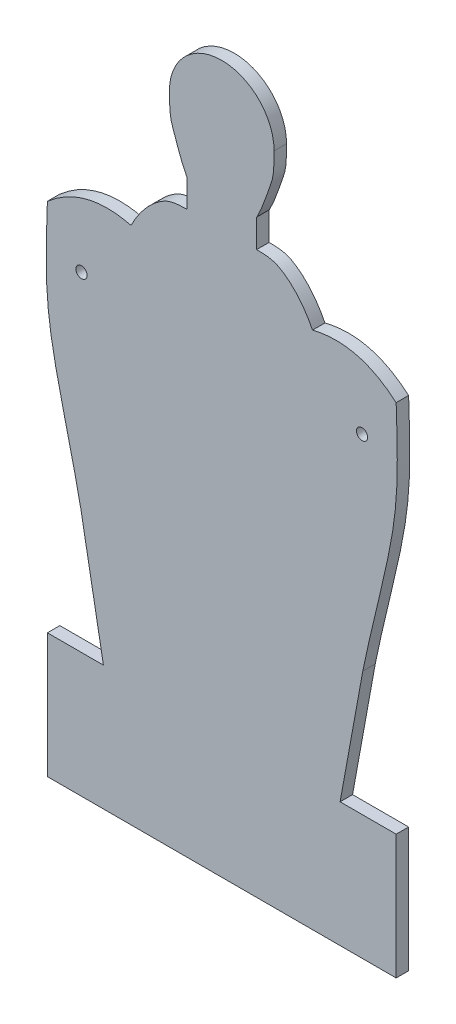
ISO-10303-21;
HEADER;
FILE_DESCRIPTION(('STEP AP214'),'2;1');
FILE_NAME('part.step','',(''),(''),'','','');
FILE_SCHEMA(('AUTOMOTIVE_DESIGN { 1 0 10303 214 1 1 1 1 }'));
ENDSEC;
DATA;
#1=APPLICATION_CONTEXT('core data for automotive mechanical design processes');
#2=APPLICATION_PROTOCOL_DEFINITION('international standard','automotive_design',2000,#1);
#3=PRODUCT_CONTEXT('',#1,'mechanical');
#4=PRODUCT('Part','Part','',(#3));
#5=PRODUCT_RELATED_PRODUCT_CATEGORY('part','',(#4));
#6=PRODUCT_DEFINITION_FORMATION('','',#4);
#7=PRODUCT_DEFINITION_CONTEXT('part definition',#1,'design');
#8=PRODUCT_DEFINITION('design','',#6,#7);
#9=PRODUCT_DEFINITION_SHAPE('','',#8);
#10=(LENGTH_UNIT() NAMED_UNIT(*) SI_UNIT(.MILLI.,.METRE.));
#11=(NAMED_UNIT(*) PLANE_ANGLE_UNIT() SI_UNIT($,.RADIAN.));
#12=(NAMED_UNIT(*) SI_UNIT($,.STERADIAN.) SOLID_ANGLE_UNIT());
#13=UNCERTAINTY_MEASURE_WITH_UNIT(LENGTH_MEASURE(1.E-05),#10,'distance_accuracy_value','');
#14=(GEOMETRIC_REPRESENTATION_CONTEXT(3) GLOBAL_UNCERTAINTY_ASSIGNED_CONTEXT((#13)) GLOBAL_UNIT_ASSIGNED_CONTEXT((#10,
#11,#12)) REPRESENTATION_CONTEXT('',''));
#15=CARTESIAN_POINT('',(0.,0.,0.));
#16=DIRECTION('',(0.,0.,1.));
#17=DIRECTION('',(1.,0.,0.));
#18=AXIS2_PLACEMENT_3D('',#15,#16,#17);
#19=CARTESIAN_POINT('',(37.1614459561657,-6.76783935625519,5.));
#20=DIRECTION('',(-0.983817622568775,0.179172781200503,0.));
#21=DIRECTION('',(-0.179172781200503,-0.983817622568775,0.));
#22=AXIS2_PLACEMENT_3D('',#19,#20,#21);
#23=PLANE('',#22);
#24=DIRECTION('',(0.179172781200503,0.983817622568775,0.));
#25=VECTOR('',#24,1.);
#26=CARTESIAN_POINT('',(37.1614459561657,-6.76783935625519,0.));
#27=LINE('',#26,#25);
#28=CARTESIAN_POINT('',(47.4999999999997,49.9999999999998,0.));
#29=VERTEX_POINT('',#28);
#30=CARTESIAN_POINT('',(56.6059957196473,100.,0.));
#31=VERTEX_POINT('',#30);
#32=EDGE_CURVE('E213',#29,#31,#27,.T.);
#33=ORIENTED_EDGE('',*,*,#32,.T.);
#34=DIRECTION('',(0.,0.,-1.));
#35=VECTOR('',#34,1.);
#36=CARTESIAN_POINT('',(56.6059957196473,100.,5.));
#37=LINE('',#36,#35);
#38=CARTESIAN_POINT('',(56.6059957196473,100.,5.));
#39=VERTEX_POINT('',#38);
#40=EDGE_CURVE('E11',#39,#31,#37,.T.);
#41=ORIENTED_EDGE('',*,*,#40,.F.);
#42=DIRECTION('',(0.179172781200503,0.983817622568775,0.));
#43=VECTOR('',#42,1.);
#44=CARTESIAN_POINT('',(37.1614459561657,-6.76783935625519,5.));
#45=LINE('',#44,#43);
#46=CARTESIAN_POINT('',(47.4999999999997,49.9999999999998,5.));
#47=VERTEX_POINT('',#46);
#48=EDGE_CURVE('E324',#47,#39,#45,.T.);
#49=ORIENTED_EDGE('',*,*,#48,.F.);
#50=DIRECTION('',(0.,0.,-1.));
#51=VECTOR('',#50,1.);
#52=CARTESIAN_POINT('',(47.4999999999997,49.9999999999998,5.));
#53=LINE('',#52,#51);
#54=EDGE_CURVE('E209',#47,#29,#53,.T.);
#55=ORIENTED_EDGE('',*,*,#54,.T.);
#56=EDGE_LOOP('',(#33,#41,#49,#55));
#57=FACE_BOUND('',#56,.T.);
#58=ADVANCED_FACE('F40',(#57),#23,.F.);
#59=CARTESIAN_POINT('',(56.605995719648,100.,5.));
#60=CARTESIAN_POINT('',(58.8228815779306,111.230467147006,5.));
#61=CARTESIAN_POINT('',(70.6241014531381,157.653217098023,5.));
#62=CARTESIAN_POINT('',(70.9834961751367,170.948411874981,5.));
#63=CARTESIAN_POINT('',(70.,200.,5.));
#64=B_SPLINE_CURVE_WITH_KNOTS('',3,(#59,#60,#61,#62,#63),.UNSPECIFIED.,.F.,.F.,(4,1,4),(0.,
0.304799143868589,1.),.UNSPECIFIED.);
#65=DIRECTION('',(0.,0.,-1.));
#66=VECTOR('',#65,1.);
#67=SURFACE_OF_LINEAR_EXTRUSION('',#64,#66);
#68=CARTESIAN_POINT('',(56.605995719648,100.,0.));
#69=CARTESIAN_POINT('',(58.8228815779306,111.230467147006,0.));
#70=CARTESIAN_POINT('',(70.6241014531381,157.653217098023,0.));
#71=CARTESIAN_POINT('',(70.9834961751367,170.948411874981,0.));
#72=CARTESIAN_POINT('',(70.,200.,0.));
#73=B_SPLINE_CURVE_WITH_KNOTS('',3,(#68,#69,#70,#71,#72),.UNSPECIFIED.,.F.,.F.,(4,1,4),(0.,
0.304799143868589,1.),.UNSPECIFIED.);
#74=CARTESIAN_POINT('',(70.,200.,0.));
#75=VERTEX_POINT('',#74);
#76=EDGE_CURVE('E217',#31,#75,#73,.T.);
#77=ORIENTED_EDGE('',*,*,#76,.T.);
#78=DIRECTION('',(0.,0.,-1.));
#79=VECTOR('',#78,1.);
#80=CARTESIAN_POINT('',(70.,200.,5.));
#81=LINE('',#80,#79);
#82=CARTESIAN_POINT('',(70.,200.,5.));
#83=VERTEX_POINT('',#82);
#84=EDGE_CURVE('E49',#83,#75,#81,.T.);
#85=ORIENTED_EDGE('',*,*,#84,.F.);
#86=EDGE_CURVE('E136',#39,#83,#64,.T.);
#87=ORIENTED_EDGE('',*,*,#86,.F.);
#88=ORIENTED_EDGE('',*,*,#40,.T.);
#89=EDGE_LOOP('',(#77,#85,#87,#88));
#90=FACE_BOUND('',#89,.T.);
#91=ADVANCED_FACE('F422',(#90),#67,.F.);
#92=CARTESIAN_POINT('',(70.,200.,5.));
#93=CARTESIAN_POINT('',(54.9401728125551,213.077606656777,5.));
#94=CARTESIAN_POINT('',(36.4,208.4,5.));
#95=B_SPLINE_CURVE_WITH_KNOTS('',2,(#92,#93,#94),.UNSPECIFIED.,.F.,.F.,(3,3),(0.,1.),.UNSPECIFIED.);
#96=DIRECTION('',(0.,0.,-1.));
#97=VECTOR('',#96,1.);
#98=SURFACE_OF_LINEAR_EXTRUSION('',#95,#97);
#99=CARTESIAN_POINT('',(70.,200.,0.));
#100=CARTESIAN_POINT('',(54.9401728125551,213.077606656777,0.));
#101=CARTESIAN_POINT('',(36.4,208.4,0.));
#102=B_SPLINE_CURVE_WITH_KNOTS('',2,(#99,#100,#101),.UNSPECIFIED.,.F.,.F.,(3,3),(0.,1.),.UNSPECIFIED.);
#103=CARTESIAN_POINT('',(36.4,208.4,0.));
#104=VERTEX_POINT('',#103);
#105=EDGE_CURVE('E223',#75,#104,#102,.T.);
#106=ORIENTED_EDGE('',*,*,#105,.T.);
#107=DIRECTION('',(0.,0.,-1.));
#108=VECTOR('',#107,1.);
#109=CARTESIAN_POINT('',(36.4,208.4,5.));
#110=LINE('',#109,#108);
#111=CARTESIAN_POINT('',(36.4,208.4,5.));
#112=VERTEX_POINT('',#111);
#113=EDGE_CURVE('E372',#112,#104,#110,.T.);
#114=ORIENTED_EDGE('',*,*,#113,.F.);
#115=EDGE_CURVE('E382',#83,#112,#95,.T.);
#116=ORIENTED_EDGE('',*,*,#115,.F.);
#117=ORIENTED_EDGE('',*,*,#84,.T.);
#118=EDGE_LOOP('',(#106,#114,#116,#117));
#119=FACE_BOUND('',#118,.T.);
#120=ADVANCED_FACE('F380',(#119),#98,.F.);
#121=CARTESIAN_POINT('',(36.4,208.4,5.));
#122=CARTESIAN_POINT('',(36.3844257793692,208.408148411344,5.));
#123=CARTESIAN_POINT('',(31.8537188994462,218.69503534175,5.));
#124=CARTESIAN_POINT('',(19.6252294284112,225.496752596779,5.));
#125=CARTESIAN_POINT('',(14.2871200733306,225.126645693906,5.));
#126=CARTESIAN_POINT('',(13.9999999999992,225.2,5.));
#127=B_SPLINE_CURVE_WITH_KNOTS('',3,(#121,#122,#123,#124,#125,#126),.UNSPECIFIED.,.F.,.F.,(4,1,
1,4),(0.,0.552885047506551,0.635199121808182,0.823140743016311),.UNSPECIFIED.);
#128=DIRECTION('',(0.,0.,-1.));
#129=VECTOR('',#128,1.);
#130=SURFACE_OF_LINEAR_EXTRUSION('',#127,#129);
#131=CARTESIAN_POINT('',(36.4,208.4,0.));
#132=CARTESIAN_POINT('',(36.3844257793692,208.408148411344,0.));
#133=CARTESIAN_POINT('',(31.8537188994462,218.69503534175,0.));
#134=CARTESIAN_POINT('',(19.6252294284112,225.496752596779,0.));
#135=CARTESIAN_POINT('',(14.2871200733306,225.126645693906,0.));
#136=CARTESIAN_POINT('',(13.9999999999992,225.2,0.));
#137=B_SPLINE_CURVE_WITH_KNOTS('',3,(#131,#132,#133,#134,#135,#136),.UNSPECIFIED.,.F.,.F.,(4,1,
1,4),(0.,0.552885047506551,0.635199121808182,0.823140743016311),.UNSPECIFIED.);
#138=CARTESIAN_POINT('',(13.9999999999987,225.2,0.));
#139=VERTEX_POINT('',#138);
#140=EDGE_CURVE('E231',#104,#139,#137,.T.);
#141=ORIENTED_EDGE('',*,*,#140,.T.);
#142=DIRECTION('',(0.,0.,-1.));
#143=VECTOR('',#142,1.);
#144=CARTESIAN_POINT('',(13.9999999999987,225.2,5.));
#145=LINE('',#144,#143);
#146=CARTESIAN_POINT('',(13.9999999999987,225.2,5.));
#147=VERTEX_POINT('',#146);
#148=EDGE_CURVE('E369',#147,#139,#145,.T.);
#149=ORIENTED_EDGE('',*,*,#148,.F.);
#150=EDGE_CURVE('E394',#112,#147,#127,.T.);
#151=ORIENTED_EDGE('',*,*,#150,.F.);
#152=ORIENTED_EDGE('',*,*,#113,.T.);
#153=EDGE_LOOP('',(#141,#149,#151,#152));
#154=FACE_BOUND('',#153,.T.);
#155=ADVANCED_FACE('F391',(#154),#130,.F.);
#156=CARTESIAN_POINT('',(13.9999999999892,-5.91032277210079E-13,5.));
#157=DIRECTION('',(1.,0.,0.));
#158=DIRECTION('',(0.,1.,0.));
#159=AXIS2_PLACEMENT_3D('',#156,#157,#158);
#160=PLANE('',#159);
#161=DIRECTION('',(0.,-1.,0.));
#162=VECTOR('',#161,1.);
#163=CARTESIAN_POINT('',(13.9999999999892,-5.91032277210079E-13,0.));
#164=LINE('',#163,#162);
#165=CARTESIAN_POINT('',(13.9999999999992,236.488415854173,0.));
#166=VERTEX_POINT('',#165);
#167=EDGE_CURVE('E240',#166,#139,#164,.T.);
#168=ORIENTED_EDGE('',*,*,#167,.F.);
#169=DIRECTION('',(0.,0.,-1.));
#170=VECTOR('',#169,1.);
#171=CARTESIAN_POINT('',(13.9999999999992,236.488415854173,5.));
#172=LINE('',#171,#170);
#173=CARTESIAN_POINT('',(13.9999999999992,236.488415854173,5.));
#174=VERTEX_POINT('',#173);
#175=EDGE_CURVE('E366',#174,#166,#172,.T.);
#176=ORIENTED_EDGE('',*,*,#175,.F.);
#177=DIRECTION('',(0.,-1.,0.));
#178=VECTOR('',#177,1.);
#179=CARTESIAN_POINT('',(13.9999999999892,-5.91032277210079E-13,5.));
#180=LINE('',#179,#178);
#181=EDGE_CURVE('E397',#174,#147,#180,.T.);
#182=ORIENTED_EDGE('',*,*,#181,.T.);
#183=ORIENTED_EDGE('',*,*,#148,.T.);
#184=EDGE_LOOP('',(#168,#176,#182,#183));
#185=FACE_BOUND('',#184,.T.);
#186=ADVANCED_FACE('F419',(#185),#160,.T.);
#187=CARTESIAN_POINT('',(13.2883216349393,237.190921302341,5.));
#188=DIRECTION('',(0.,0.,-1.));
#189=DIRECTION('',(-1.,0.,0.));
#190=AXIS2_PLACEMENT_3D('',#187,#188,#189);
#191=CYLINDRICAL_SURFACE('',#190,0.99999999999988);
#192=CARTESIAN_POINT('',(13.2883216349393,237.190921302341,0.));
#193=DIRECTION('',(0.,0.,1.));
#194=DIRECTION('',(1.,0.,0.));
#195=AXIS2_PLACEMENT_3D('',#192,#193,#194);
#196=CIRCLE('',#195,0.99999999999988);
#197=CARTESIAN_POINT('',(14.1721420775489,236.723095025583,0.));
#198=VERTEX_POINT('',#197);
#199=EDGE_CURVE('E247',#166,#198,#196,.T.);
#200=ORIENTED_EDGE('',*,*,#199,.T.);
#201=DIRECTION('',(0.,0.,-1.));
#202=VECTOR('',#201,1.);
#203=CARTESIAN_POINT('',(14.1721420775489,236.723095025583,5.));
#204=LINE('',#203,#202);
#205=CARTESIAN_POINT('',(14.1721420775489,236.723095025583,5.));
#206=VERTEX_POINT('',#205);
#207=EDGE_CURVE('E362',#206,#198,#204,.T.);
#208=ORIENTED_EDGE('',*,*,#207,.F.);
#209=CARTESIAN_POINT('',(13.2883216349393,237.190921302341,5.));
#210=DIRECTION('',(0.,0.,1.));
#211=DIRECTION('',(1.,0.,0.));
#212=AXIS2_PLACEMENT_3D('',#209,#210,#211);
#213=CIRCLE('',#212,0.99999999999988);
#214=EDGE_CURVE('E401',#174,#206,#213,.T.);
#215=ORIENTED_EDGE('',*,*,#214,.F.);
#216=ORIENTED_EDGE('',*,*,#175,.T.);
#217=EDGE_LOOP('',(#200,#208,#215,#216));
#218=FACE_BOUND('',#217,.T.);
#219=ADVANCED_FACE('F545',(#218),#191,.T.);
#220=CARTESIAN_POINT('',(14.1721420775506,236.723095025583,5.));
#221=CARTESIAN_POINT('',(16.4386826222362,241.005058153603,5.));
#222=CARTESIAN_POINT('',(19.848023934084,251.9613261609,5.));
#223=CARTESIAN_POINT('',(20.9809390103609,253.933353369458,5.));
#224=CARTESIAN_POINT('',(21.,263.,5.));
#225=B_SPLINE_CURVE_WITH_KNOTS('',3,(#220,#221,#222,#223,#224),.UNSPECIFIED.,.F.,.F.,(4,1,4),
(0.00927567658189249,0.377960332412219,0.746644988242546),.UNSPECIFIED.);
#226=DIRECTION('',(0.,0.,-1.));
#227=VECTOR('',#226,1.);
#228=SURFACE_OF_LINEAR_EXTRUSION('',#225,#227);
#229=CARTESIAN_POINT('',(14.1721420775506,236.723095025583,0.));
#230=CARTESIAN_POINT('',(16.4386826222362,241.005058153603,0.));
#231=CARTESIAN_POINT('',(19.848023934084,251.9613261609,0.));
#232=CARTESIAN_POINT('',(20.9809390103609,253.933353369458,0.));
#233=CARTESIAN_POINT('',(21.,263.,0.));
#234=B_SPLINE_CURVE_WITH_KNOTS('',3,(#229,#230,#231,#232,#233),.UNSPECIFIED.,.F.,.F.,(4,1,4),
(0.00927567658189249,0.377960332412219,0.746644988242546),.UNSPECIFIED.);
#235=CARTESIAN_POINT('',(20.9999999999991,263.,0.));
#236=VERTEX_POINT('',#235);
#237=EDGE_CURVE('E250',#198,#236,#234,.T.);
#238=ORIENTED_EDGE('',*,*,#237,.T.);
#239=DIRECTION('',(0.,0.,-1.));
#240=VECTOR('',#239,1.);
#241=CARTESIAN_POINT('',(20.9999999999991,263.,5.));
#242=LINE('',#241,#240);
#243=CARTESIAN_POINT('',(20.9999999999991,263.,5.));
#244=VERTEX_POINT('',#243);
#245=EDGE_CURVE('E358',#244,#236,#242,.T.);
#246=ORIENTED_EDGE('',*,*,#245,.F.);
#247=EDGE_CURVE('E539',#206,#244,#225,.T.);
#248=ORIENTED_EDGE('',*,*,#247,.F.);
#249=ORIENTED_EDGE('',*,*,#207,.T.);
#250=EDGE_LOOP('',(#238,#246,#248,#249));
#251=FACE_BOUND('',#250,.T.);
#252=ADVANCED_FACE('F538',(#251),#228,.F.);
#253=CARTESIAN_POINT('',(0.,263.,5.));
#254=DIRECTION('',(0.,0.,-1.));
#255=DIRECTION('',(-1.,0.,0.));
#256=AXIS2_PLACEMENT_3D('',#253,#254,#255);
#257=CYLINDRICAL_SURFACE('',#256,20.9999999999991);
#258=CARTESIAN_POINT('',(0.,263.,0.));
#259=DIRECTION('',(0.,0.,1.));
#260=DIRECTION('',(1.,0.,0.));
#261=AXIS2_PLACEMENT_3D('',#258,#259,#260);
#262=CIRCLE('',#261,20.9999999999991);
#263=CARTESIAN_POINT('',(-20.9999999999991,263.,0.));
#264=VERTEX_POINT('',#263);
#265=EDGE_CURVE('E255',#236,#264,#262,.T.);
#266=ORIENTED_EDGE('',*,*,#265,.T.);
#267=DIRECTION('',(0.,0.,-1.));
#268=VECTOR('',#267,1.);
#269=CARTESIAN_POINT('',(-20.9999999999991,263.,5.));
#270=LINE('',#269,#268);
#271=CARTESIAN_POINT('',(-20.9999999999991,263.,5.));
#272=VERTEX_POINT('',#271);
#273=EDGE_CURVE('E355',#272,#264,#270,.T.);
#274=ORIENTED_EDGE('',*,*,#273,.F.);
#275=CARTESIAN_POINT('',(0.,263.,5.));
#276=DIRECTION('',(0.,0.,1.));
#277=DIRECTION('',(1.,0.,0.));
#278=AXIS2_PLACEMENT_3D('',#275,#276,#277);
#279=CIRCLE('',#278,20.9999999999991);
#280=EDGE_CURVE('E535',#244,#272,#279,.T.);
#281=ORIENTED_EDGE('',*,*,#280,.F.);
#282=ORIENTED_EDGE('',*,*,#245,.T.);
#283=EDGE_LOOP('',(#266,#274,#281,#282));
#284=FACE_BOUND('',#283,.T.);
#285=ADVANCED_FACE('F533',(#284),#257,.T.);
#286=CARTESIAN_POINT('',(-14.1721420775506,236.723095025583,5.));
#287=CARTESIAN_POINT('',(-16.4386826222362,241.005058153603,5.));
#288=CARTESIAN_POINT('',(-19.848023934084,251.9613261609,5.));
#289=CARTESIAN_POINT('',(-20.9809390103609,253.933353369458,5.));
#290=CARTESIAN_POINT('',(-21.,263.,5.));
#291=B_SPLINE_CURVE_WITH_KNOTS('',3,(#286,#287,#288,#289,#290),.UNSPECIFIED.,.F.,.F.,(4,1,4),
(0.00927567658189249,0.377960332412219,0.746644988242546),.UNSPECIFIED.);
#292=DIRECTION('',(0.,0.,-1.));
#293=VECTOR('',#292,1.);
#294=SURFACE_OF_LINEAR_EXTRUSION('',#291,#293);
#295=CARTESIAN_POINT('',(-14.1721420775506,236.723095025583,0.));
#296=CARTESIAN_POINT('',(-16.4386826222362,241.005058153603,0.));
#297=CARTESIAN_POINT('',(-19.848023934084,251.9613261609,0.));
#298=CARTESIAN_POINT('',(-20.9809390103609,253.933353369458,0.));
#299=CARTESIAN_POINT('',(-21.,263.,0.));
#300=B_SPLINE_CURVE_WITH_KNOTS('',3,(#295,#296,#297,#298,#299),.UNSPECIFIED.,.F.,.F.,(4,1,4),
(0.00927567658189249,0.377960332412219,0.746644988242546),.UNSPECIFIED.);
#301=CARTESIAN_POINT('',(-14.17214207755,236.723095025583,0.));
#302=VERTEX_POINT('',#301);
#303=EDGE_CURVE('E262',#302,#264,#300,.T.);
#304=ORIENTED_EDGE('',*,*,#303,.F.);
#305=DIRECTION('',(0.,0.,-1.));
#306=VECTOR('',#305,1.);
#307=CARTESIAN_POINT('',(-14.17214207755,236.723095025583,5.));
#308=LINE('',#307,#306);
#309=CARTESIAN_POINT('',(-14.17214207755,236.723095025583,5.));
#310=VERTEX_POINT('',#309);
#311=EDGE_CURVE('E352',#310,#302,#308,.T.);
#312=ORIENTED_EDGE('',*,*,#311,.F.);
#313=EDGE_CURVE('E530',#310,#272,#291,.T.);
#314=ORIENTED_EDGE('',*,*,#313,.T.);
#315=ORIENTED_EDGE('',*,*,#273,.T.);
#316=EDGE_LOOP('',(#304,#312,#314,#315));
#317=FACE_BOUND('',#316,.T.);
#318=ADVANCED_FACE('F526',(#317),#294,.T.);
#319=CARTESIAN_POINT('',(-13.288321634941,237.190921302341,5.));
#320=DIRECTION('',(0.,0.,-1.));
#321=DIRECTION('',(-1.,0.,0.));
#322=AXIS2_PLACEMENT_3D('',#319,#320,#321);
#323=CYLINDRICAL_SURFACE('',#322,0.99999999999929);
#324=CARTESIAN_POINT('',(-13.288321634941,237.190921302341,0.));
#325=DIRECTION('',(0.,0.,1.));
#326=DIRECTION('',(1.,0.,0.));
#327=AXIS2_PLACEMENT_3D('',#324,#325,#326);
#328=CIRCLE('',#327,0.99999999999929);
#329=CARTESIAN_POINT('',(-13.9999999999992,236.488415854173,0.));
#330=VERTEX_POINT('',#329);
#331=EDGE_CURVE('E268',#330,#302,#328,.F.);
#332=ORIENTED_EDGE('',*,*,#331,.F.);
#333=DIRECTION('',(0.,0.,-1.));
#334=VECTOR('',#333,1.);
#335=CARTESIAN_POINT('',(-13.9999999999992,236.488415854173,5.));
#336=LINE('',#335,#334);
#337=CARTESIAN_POINT('',(-13.9999999999992,236.488415854173,5.));
#338=VERTEX_POINT('',#337);
#339=EDGE_CURVE('E349',#338,#330,#336,.T.);
#340=ORIENTED_EDGE('',*,*,#339,.F.);
#341=CARTESIAN_POINT('',(-13.288321634941,237.190921302341,5.));
#342=DIRECTION('',(0.,0.,1.));
#343=DIRECTION('',(1.,0.,0.));
#344=AXIS2_PLACEMENT_3D('',#341,#342,#343);
#345=CIRCLE('',#344,0.99999999999929);
#346=EDGE_CURVE('E521',#338,#310,#345,.F.);
#347=ORIENTED_EDGE('',*,*,#346,.T.);
#348=ORIENTED_EDGE('',*,*,#311,.T.);
#349=EDGE_LOOP('',(#332,#340,#347,#348));
#350=FACE_BOUND('',#349,.T.);
#351=ADVANCED_FACE('F520',(#350),#323,.T.);
#352=CARTESIAN_POINT('',(-14.0000000000107,6.80190430950842E-13,5.));
#353=DIRECTION('',(1.,0.,0.));
#354=DIRECTION('',(0.,1.,0.));
#355=AXIS2_PLACEMENT_3D('',#352,#353,#354);
#356=PLANE('',#355);
#357=DIRECTION('',(0.,-1.,0.));
#358=VECTOR('',#357,1.);
#359=CARTESIAN_POINT('',(-14.0000000000107,6.80190430950842E-13,0.));
#360=LINE('',#359,#358);
#361=CARTESIAN_POINT('',(-13.9999999999997,225.2,0.));
#362=VERTEX_POINT('',#361);
#363=EDGE_CURVE('E275',#330,#362,#360,.T.);
#364=ORIENTED_EDGE('',*,*,#363,.T.);
#365=DIRECTION('',(0.,0.,-1.));
#366=VECTOR('',#365,1.);
#367=CARTESIAN_POINT('',(-13.9999999999997,225.2,5.));
#368=LINE('',#367,#366);
#369=CARTESIAN_POINT('',(-13.9999999999997,225.2,5.));
#370=VERTEX_POINT('',#369);
#371=EDGE_CURVE('E346',#370,#362,#368,.T.);
#372=ORIENTED_EDGE('',*,*,#371,.F.);
#373=DIRECTION('',(0.,-1.,0.));
#374=VECTOR('',#373,1.);
#375=CARTESIAN_POINT('',(-14.0000000000107,6.80190430950842E-13,5.));
#376=LINE('',#375,#374);
#377=EDGE_CURVE('E516',#338,#370,#376,.T.);
#378=ORIENTED_EDGE('',*,*,#377,.F.);
#379=ORIENTED_EDGE('',*,*,#339,.T.);
#380=EDGE_LOOP('',(#364,#372,#378,#379));
#381=FACE_BOUND('',#380,.T.);
#382=ADVANCED_FACE('F515',(#381),#356,.F.);
#383=CARTESIAN_POINT('',(-36.4,208.4,5.));
#384=CARTESIAN_POINT('',(-36.3844257793692,208.408148411344,5.));
#385=CARTESIAN_POINT('',(-31.8537188994462,218.69503534175,5.));
#386=CARTESIAN_POINT('',(-19.6252294284112,225.496752596779,5.));
#387=CARTESIAN_POINT('',(-14.2871200733306,225.126645693906,5.));
#388=CARTESIAN_POINT('',(-13.9999999999992,225.2,5.));
#389=B_SPLINE_CURVE_WITH_KNOTS('',3,(#383,#384,#385,#386,#387,#388),.UNSPECIFIED.,.F.,.F.,(4,1,
1,4),(0.,0.552885047506551,0.635199121808182,0.823140743016311),.UNSPECIFIED.);
#390=DIRECTION('',(0.,0.,-1.));
#391=VECTOR('',#390,1.);
#392=SURFACE_OF_LINEAR_EXTRUSION('',#389,#391);
#393=CARTESIAN_POINT('',(-36.4,208.4,0.));
#394=CARTESIAN_POINT('',(-36.3844257793692,208.408148411344,0.));
#395=CARTESIAN_POINT('',(-31.8537188994462,218.69503534175,0.));
#396=CARTESIAN_POINT('',(-19.6252294284112,225.496752596779,0.));
#397=CARTESIAN_POINT('',(-14.2871200733306,225.126645693906,0.));
#398=CARTESIAN_POINT('',(-13.9999999999992,225.2,0.));
#399=B_SPLINE_CURVE_WITH_KNOTS('',3,(#393,#394,#395,#396,#397,#398),.UNSPECIFIED.,.F.,.F.,(4,1,
1,4),(0.,0.552885047506551,0.635199121808182,0.823140743016311),.UNSPECIFIED.);
#400=CARTESIAN_POINT('',(-36.4,208.4,0.));
#401=VERTEX_POINT('',#400);
#402=EDGE_CURVE('E279',#401,#362,#399,.T.);
#403=ORIENTED_EDGE('',*,*,#402,.F.);
#404=DIRECTION('',(0.,0.,-1.));
#405=VECTOR('',#404,1.);
#406=CARTESIAN_POINT('',(-36.4,208.4,5.));
#407=LINE('',#406,#405);
#408=CARTESIAN_POINT('',(-36.4,208.4,5.));
#409=VERTEX_POINT('',#408);
#410=EDGE_CURVE('E343',#409,#401,#407,.T.);
#411=ORIENTED_EDGE('',*,*,#410,.F.);
#412=EDGE_CURVE('E512',#409,#370,#389,.T.);
#413=ORIENTED_EDGE('',*,*,#412,.T.);
#414=ORIENTED_EDGE('',*,*,#371,.T.);
#415=EDGE_LOOP('',(#403,#411,#413,#414));
#416=FACE_BOUND('',#415,.T.);
#417=ADVANCED_FACE('F508',(#416),#392,.T.);
#418=CARTESIAN_POINT('',(-70.,200.,5.));
#419=CARTESIAN_POINT('',(-54.9401728125551,213.077606656777,5.));
#420=CARTESIAN_POINT('',(-36.4,208.4,5.));
#421=B_SPLINE_CURVE_WITH_KNOTS('',2,(#418,#419,#420),.UNSPECIFIED.,.F.,.F.,(3,3),(0.,1.),.UNSPECIFIED.);
#422=DIRECTION('',(0.,0.,-1.));
#423=VECTOR('',#422,1.);
#424=SURFACE_OF_LINEAR_EXTRUSION('',#421,#423);
#425=CARTESIAN_POINT('',(-70.,200.,0.));
#426=CARTESIAN_POINT('',(-54.9401728125551,213.077606656777,0.));
#427=CARTESIAN_POINT('',(-36.4,208.4,0.));
#428=B_SPLINE_CURVE_WITH_KNOTS('',2,(#425,#426,#427),.UNSPECIFIED.,.F.,.F.,(3,3),(0.,1.),.UNSPECIFIED.);
#429=CARTESIAN_POINT('',(-70.,200.,0.));
#430=VERTEX_POINT('',#429);
#431=EDGE_CURVE('E285',#430,#401,#428,.T.);
#432=ORIENTED_EDGE('',*,*,#431,.F.);
#433=DIRECTION('',(0.,0.,-1.));
#434=VECTOR('',#433,1.);
#435=CARTESIAN_POINT('',(-70.,200.,5.));
#436=LINE('',#435,#434);
#437=CARTESIAN_POINT('',(-70.,200.,5.));
#438=VERTEX_POINT('',#437);
#439=EDGE_CURVE('E340',#438,#430,#436,.T.);
#440=ORIENTED_EDGE('',*,*,#439,.F.);
#441=EDGE_CURVE('E589',#438,#409,#421,.T.);
#442=ORIENTED_EDGE('',*,*,#441,.T.);
#443=ORIENTED_EDGE('',*,*,#410,.T.);
#444=EDGE_LOOP('',(#432,#440,#442,#443));
#445=FACE_BOUND('',#444,.T.);
#446=ADVANCED_FACE('F503',(#445),#424,.T.);
#447=CARTESIAN_POINT('',(-56.605995719648,100.,5.));
#448=CARTESIAN_POINT('',(-58.8228815779306,111.230467147006,5.));
#449=CARTESIAN_POINT('',(-70.6241014531381,157.653217098023,5.));
#450=CARTESIAN_POINT('',(-70.9834961751367,170.948411874981,5.));
#451=CARTESIAN_POINT('',(-70.,200.,5.));
#452=B_SPLINE_CURVE_WITH_KNOTS('',3,(#447,#448,#449,#450,#451),.UNSPECIFIED.,.F.,.F.,(4,1,4),
(0.,0.304799143868589,1.),.UNSPECIFIED.);
#453=DIRECTION('',(0.,0.,-1.));
#454=VECTOR('',#453,1.);
#455=SURFACE_OF_LINEAR_EXTRUSION('',#452,#454);
#456=CARTESIAN_POINT('',(-56.605995719648,100.,0.));
#457=CARTESIAN_POINT('',(-58.8228815779306,111.230467147006,0.));
#458=CARTESIAN_POINT('',(-70.6241014531381,157.653217098023,0.));
#459=CARTESIAN_POINT('',(-70.9834961751367,170.948411874981,0.));
#460=CARTESIAN_POINT('',(-70.,200.,0.));
#461=B_SPLINE_CURVE_WITH_KNOTS('',3,(#456,#457,#458,#459,#460),.UNSPECIFIED.,.F.,.F.,(4,1,4),
(0.,0.304799143868589,1.),.UNSPECIFIED.);
#462=CARTESIAN_POINT('',(-56.605995719648,100.,0.));
#463=VERTEX_POINT('',#462);
#464=EDGE_CURVE('E294',#463,#430,#461,.T.);
#465=ORIENTED_EDGE('',*,*,#464,.F.);
#466=DIRECTION('',(0.,0.,-1.));
#467=VECTOR('',#466,1.);
#468=CARTESIAN_POINT('',(-56.605995719648,100.,5.));
#469=LINE('',#468,#467);
#470=CARTESIAN_POINT('',(-56.605995719648,100.,5.));
#471=VERTEX_POINT('',#470);
#472=EDGE_CURVE('E337',#471,#463,#469,.T.);
#473=ORIENTED_EDGE('',*,*,#472,.F.);
#474=EDGE_CURVE('E499',#471,#438,#452,.T.);
#475=ORIENTED_EDGE('',*,*,#474,.T.);
#476=ORIENTED_EDGE('',*,*,#439,.T.);
#477=EDGE_LOOP('',(#465,#473,#475,#476));
#478=FACE_BOUND('',#477,.T.);
#479=ADVANCED_FACE('F497',(#478),#455,.T.);
#480=CARTESIAN_POINT('',(-37.1614459561656,-6.76783935625544,5.));
#481=DIRECTION('',(-0.983817622568774,-0.179172781200509,0.));
#482=DIRECTION('',(0.179172781200509,-0.983817622568774,0.));
#483=AXIS2_PLACEMENT_3D('',#480,#481,#482);
#484=PLANE('',#483);
#485=DIRECTION('',(-0.179172781200509,0.983817622568774,0.));
#486=VECTOR('',#485,1.);
#487=CARTESIAN_POINT('',(-37.1614459561656,-6.76783935625544,0.));
#488=LINE('',#487,#486);
#489=CARTESIAN_POINT('',(-47.5,49.9999999999998,0.));
#490=VERTEX_POINT('',#489);
#491=EDGE_CURVE('E303',#490,#463,#488,.T.);
#492=ORIENTED_EDGE('',*,*,#491,.F.);
#493=DIRECTION('',(0.,0.,-1.));
#494=VECTOR('',#493,1.);
#495=CARTESIAN_POINT('',(-47.5,49.9999999999998,5.));
#496=LINE('',#495,#494);
#497=CARTESIAN_POINT('',(-47.5,49.9999999999998,5.));
#498=VERTEX_POINT('',#497);
#499=EDGE_CURVE('E334',#498,#490,#496,.T.);
#500=ORIENTED_EDGE('',*,*,#499,.F.);
#501=DIRECTION('',(-0.179172781200509,0.983817622568774,0.));
#502=VECTOR('',#501,1.);
#503=CARTESIAN_POINT('',(-37.1614459561656,-6.76783935625544,5.));
#504=LINE('',#503,#502);
#505=EDGE_CURVE('E493',#498,#471,#504,.T.);
#506=ORIENTED_EDGE('',*,*,#505,.T.);
#507=ORIENTED_EDGE('',*,*,#472,.T.);
#508=EDGE_LOOP('',(#492,#500,#506,#507));
#509=FACE_BOUND('',#508,.T.);
#510=ADVANCED_FACE('F490',(#509),#484,.T.);
#511=CARTESIAN_POINT('',(4.0091387000695E-13,49.9999999999994,5.));
#512=DIRECTION('',(0.,1.,0.));
#513=DIRECTION('',(-1.,0.,0.));
#514=AXIS2_PLACEMENT_3D('',#511,#512,#513);
#515=PLANE('',#514);
#516=DIRECTION('',(1.,0.,0.));
#517=VECTOR('',#516,1.);
#518=CARTESIAN_POINT('',(4.0091387000695E-13,49.9999999999994,0.));
#519=LINE('',#518,#517);
#520=CARTESIAN_POINT('',(-69.9999999998077,50.,0.));
#521=VERTEX_POINT('',#520);
#522=EDGE_CURVE('E310',#521,#490,#519,.T.);
#523=ORIENTED_EDGE('',*,*,#522,.F.);
#524=DIRECTION('',(0.,0.,-1.));
#525=VECTOR('',#524,1.);
#526=CARTESIAN_POINT('',(-69.9999999998077,50.,5.));
#527=LINE('',#526,#525);
#528=CARTESIAN_POINT('',(-69.9999999998077,50.,5.));
#529=VERTEX_POINT('',#528);
#530=EDGE_CURVE('E331',#529,#521,#527,.T.);
#531=ORIENTED_EDGE('',*,*,#530,.F.);
#532=DIRECTION('',(1.,0.,0.));
#533=VECTOR('',#532,1.);
#534=CARTESIAN_POINT('',(4.0091387000695E-13,49.9999999999994,5.));
#535=LINE('',#534,#533);
#536=EDGE_CURVE('E763',#529,#498,#535,.T.);
#537=ORIENTED_EDGE('',*,*,#536,.T.);
#538=ORIENTED_EDGE('',*,*,#499,.T.);
#539=EDGE_LOOP('',(#523,#531,#537,#538));
#540=FACE_BOUND('',#539,.T.);
#541=ADVANCED_FACE('F486',(#540),#515,.T.);
#542=CARTESIAN_POINT('',(-70.,2.69206879011108E-10,5.));
#543=DIRECTION('',(-1.,3.84581255730154E-12,0.));
#544=DIRECTION('',(-3.84581255730154E-12,-1.,0.));
#545=AXIS2_PLACEMENT_3D('',#542,#543,#544);
#546=PLANE('',#545);
#547=DIRECTION('',(3.84581255730154E-12,1.,0.));
#548=VECTOR('',#547,1.);
#549=CARTESIAN_POINT('',(-70.,2.69206879011108E-10,0.));
#550=LINE('',#549,#548);
#551=CARTESIAN_POINT('',(-70.,0.,0.));
#552=VERTEX_POINT('',#551);
#553=EDGE_CURVE('E314',#552,#521,#550,.T.);
#554=ORIENTED_EDGE('',*,*,#553,.F.);
#555=DIRECTION('',(0.,0.,-1.));
#556=VECTOR('',#555,1.);
#557=CARTESIAN_POINT('',(-70.,0.,5.));
#558=LINE('',#557,#556);
#559=CARTESIAN_POINT('',(-70.,0.,5.));
#560=VERTEX_POINT('',#559);
#561=EDGE_CURVE('E202',#560,#552,#558,.T.);
#562=ORIENTED_EDGE('',*,*,#561,.F.);
#563=DIRECTION('',(3.84581255730154E-12,1.,0.));
#564=VECTOR('',#563,1.);
#565=CARTESIAN_POINT('',(-70.,2.69206879011108E-10,5.));
#566=LINE('',#565,#564);
#567=EDGE_CURVE('E193',#560,#529,#566,.T.);
#568=ORIENTED_EDGE('',*,*,#567,.T.);
#569=ORIENTED_EDGE('',*,*,#530,.T.);
#570=EDGE_LOOP('',(#554,#562,#568,#569));
#571=FACE_BOUND('',#570,.T.);
#572=ADVANCED_FACE('F482',(#571),#546,.T.);
#573=CARTESIAN_POINT('',(0.,4.44089209850063E-13,5.));
#574=DIRECTION('',(0.,1.,0.));
#575=DIRECTION('',(-1.,0.,0.));
#576=AXIS2_PLACEMENT_3D('',#573,#574,#575);
#577=PLANE('',#576);
#578=DIRECTION('',(1.,0.,0.));
#579=VECTOR('',#578,1.);
#580=CARTESIAN_POINT('',(0.,4.44089209850063E-13,0.));
#581=LINE('',#580,#579);
#582=CARTESIAN_POINT('',(70.,8.88178419700125E-13,0.));
#583=VERTEX_POINT('',#582);
#584=EDGE_CURVE('E200',#552,#583,#581,.T.);
#585=ORIENTED_EDGE('',*,*,#584,.T.);
#586=DIRECTION('',(0.,0.,-1.));
#587=VECTOR('',#586,1.);
#588=CARTESIAN_POINT('',(70.,8.88178419700125E-13,5.));
#589=LINE('',#588,#587);
#590=CARTESIAN_POINT('',(70.,8.88178419700125E-13,5.));
#591=VERTEX_POINT('',#590);
#592=EDGE_CURVE('E197',#591,#583,#589,.T.);
#593=ORIENTED_EDGE('',*,*,#592,.F.);
#594=DIRECTION('',(1.,0.,0.));
#595=VECTOR('',#594,1.);
#596=CARTESIAN_POINT('',(0.,4.44089209850063E-13,5.));
#597=LINE('',#596,#595);
#598=EDGE_CURVE('E186',#560,#591,#597,.T.);
#599=ORIENTED_EDGE('',*,*,#598,.F.);
#600=ORIENTED_EDGE('',*,*,#561,.T.);
#601=EDGE_LOOP('',(#585,#593,#599,#600));
#602=FACE_BOUND('',#601,.T.);
#603=ADVANCED_FACE('F198',(#602),#577,.F.);
#604=CARTESIAN_POINT('',(70.,2.69712030487312E-10,5.));
#605=DIRECTION('',(-1.,-3.85302900696161E-12,0.));
#606=DIRECTION('',(3.85302900696161E-12,-1.,0.));
#607=AXIS2_PLACEMENT_3D('',#604,#605,#606);
#608=PLANE('',#607);
#609=DIRECTION('',(-3.85302900696161E-12,1.,0.));
#610=VECTOR('',#609,1.);
#611=CARTESIAN_POINT('',(70.,2.69712030487312E-10,0.));
#612=LINE('',#611,#610);
#613=CARTESIAN_POINT('',(69.9999999998074,50.0000000000009,0.));
#614=VERTEX_POINT('',#613);
#615=EDGE_CURVE('E122',#583,#614,#612,.T.);
#616=ORIENTED_EDGE('',*,*,#615,.T.);
#617=DIRECTION('',(0.,0.,-1.));
#618=VECTOR('',#617,1.);
#619=CARTESIAN_POINT('',(69.9999999998074,50.0000000000009,5.));
#620=LINE('',#619,#618);
#621=CARTESIAN_POINT('',(69.9999999998074,50.0000000000009,5.));
#622=VERTEX_POINT('',#621);
#623=EDGE_CURVE('E203',#622,#614,#620,.T.);
#624=ORIENTED_EDGE('',*,*,#623,.F.);
#625=DIRECTION('',(-3.85302900696161E-12,1.,0.));
#626=VECTOR('',#625,1.);
#627=CARTESIAN_POINT('',(70.,2.69712030487312E-10,5.));
#628=LINE('',#627,#626);
#629=EDGE_CURVE('E190',#591,#622,#628,.T.);
#630=ORIENTED_EDGE('',*,*,#629,.F.);
#631=ORIENTED_EDGE('',*,*,#592,.T.);
#632=EDGE_LOOP('',(#616,#624,#630,#631));
#633=FACE_BOUND('',#632,.T.);
#634=ADVANCED_FACE('F205',(#633),#608,.F.);
#635=CARTESIAN_POINT('',(-2.37464369157954E-12,49.9999999999976,5.));
#636=DIRECTION('',(0.,-1.,0.));
#637=DIRECTION('',(1.,0.,0.));
#638=AXIS2_PLACEMENT_3D('',#635,#636,#637);
#639=PLANE('',#638);
#640=DIRECTION('',(-1.,0.,0.));
#641=VECTOR('',#640,1.);
#642=CARTESIAN_POINT('',(-2.37464369157954E-12,49.9999999999976,0.));
#643=LINE('',#642,#641);
#644=EDGE_CURVE('E128',#614,#29,#643,.T.);
#645=ORIENTED_EDGE('',*,*,#644,.T.);
#646=ORIENTED_EDGE('',*,*,#54,.F.);
#647=DIRECTION('',(-1.,0.,0.));
#648=VECTOR('',#647,1.);
#649=CARTESIAN_POINT('',(-2.37464369157954E-12,49.9999999999976,5.));
#650=LINE('',#649,#648);
#651=EDGE_CURVE('E57',#622,#47,#650,.T.);
#652=ORIENTED_EDGE('',*,*,#651,.F.);
#653=ORIENTED_EDGE('',*,*,#623,.T.);
#654=EDGE_LOOP('',(#645,#646,#652,#653));
#655=FACE_BOUND('',#654,.T.);
#656=ADVANCED_FACE('F461',(#655),#639,.F.);
#657=CARTESIAN_POINT('',(0.,0.,5.));
#658=DIRECTION('',(0.,0.,1.));
#659=DIRECTION('',(1.,0.,0.));
#660=AXIS2_PLACEMENT_3D('',#657,#658,#659);
#661=PLANE('',#660);
#662=CARTESIAN_POINT('',(-56.3,182.2,5.));
#663=DIRECTION('',(0.,0.,1.));
#664=DIRECTION('',(1.,0.,0.));
#665=AXIS2_PLACEMENT_3D('',#662,#663,#664);
#666=CIRCLE('',#665,2.25);
#667=CARTESIAN_POINT('',(-54.05,182.2,5.));
#668=VERTEX_POINT('',#667);
#669=EDGE_CURVE('E442',#668,#668,#666,.T.);
#670=ORIENTED_EDGE('',*,*,#669,.F.);
#671=EDGE_LOOP('',(#670));
#672=FACE_BOUND('',#671,.T.);
#673=CARTESIAN_POINT('',(56.2999999999987,182.2,5.));
#674=DIRECTION('',(0.,0.,1.));
#675=DIRECTION('',(-1.,0.,0.));
#676=AXIS2_PLACEMENT_3D('',#673,#674,#675);
#677=CIRCLE('',#676,2.25);
#678=CARTESIAN_POINT('',(54.0499999999987,182.2,5.));
#679=VERTEX_POINT('',#678);
#680=EDGE_CURVE('E434',#679,#679,#677,.T.);
#681=ORIENTED_EDGE('',*,*,#680,.F.);
#682=EDGE_LOOP('',(#681));
#683=FACE_BOUND('',#682,.T.);
#684=ORIENTED_EDGE('',*,*,#48,.T.);
#685=ORIENTED_EDGE('',*,*,#86,.T.);
#686=ORIENTED_EDGE('',*,*,#115,.T.);
#687=ORIENTED_EDGE('',*,*,#150,.T.);
#688=ORIENTED_EDGE('',*,*,#181,.F.);
#689=ORIENTED_EDGE('',*,*,#214,.T.);
#690=ORIENTED_EDGE('',*,*,#247,.T.);
#691=ORIENTED_EDGE('',*,*,#280,.T.);
#692=ORIENTED_EDGE('',*,*,#313,.F.);
#693=ORIENTED_EDGE('',*,*,#346,.F.);
#694=ORIENTED_EDGE('',*,*,#377,.T.);
#695=ORIENTED_EDGE('',*,*,#412,.F.);
#696=ORIENTED_EDGE('',*,*,#441,.F.);
#697=ORIENTED_EDGE('',*,*,#474,.F.);
#698=ORIENTED_EDGE('',*,*,#505,.F.);
#699=ORIENTED_EDGE('',*,*,#536,.F.);
#700=ORIENTED_EDGE('',*,*,#567,.F.);
#701=ORIENTED_EDGE('',*,*,#598,.T.);
#702=ORIENTED_EDGE('',*,*,#629,.T.);
#703=ORIENTED_EDGE('',*,*,#651,.T.);
#704=EDGE_LOOP('',(#684,#685,#686,#687,#688,#689,#690,#691,#692,#693,#694,#695,#696,#697,#698,
#699,#700,#701,#702,#703));
#705=FACE_BOUND('',#704,.T.);
#706=ADVANCED_FACE('F188',(#672,#683,#705),#661,.T.);
#707=CARTESIAN_POINT('',(0.,0.,0.));
#708=DIRECTION('',(0.,0.,1.));
#709=DIRECTION('',(1.,0.,0.));
#710=AXIS2_PLACEMENT_3D('',#707,#708,#709);
#711=PLANE('',#710);
#712=CARTESIAN_POINT('',(-56.3,182.2,0.));
#713=DIRECTION('',(0.,0.,1.));
#714=DIRECTION('',(1.,0.,0.));
#715=AXIS2_PLACEMENT_3D('',#712,#713,#714);
#716=CIRCLE('',#715,2.25);
#717=CARTESIAN_POINT('',(-54.05,182.2,0.));
#718=VERTEX_POINT('',#717);
#719=EDGE_CURVE('E218',#718,#718,#716,.T.);
#720=ORIENTED_EDGE('',*,*,#719,.T.);
#721=EDGE_LOOP('',(#720));
#722=FACE_BOUND('',#721,.T.);
#723=CARTESIAN_POINT('',(56.2999999999987,182.2,0.));
#724=DIRECTION('',(0.,0.,1.));
#725=DIRECTION('',(-1.,0.,0.));
#726=AXIS2_PLACEMENT_3D('',#723,#724,#725);
#727=CIRCLE('',#726,2.25);
#728=CARTESIAN_POINT('',(54.0499999999987,182.2,0.));
#729=VERTEX_POINT('',#728);
#730=EDGE_CURVE('E438',#729,#729,#727,.T.);
#731=ORIENTED_EDGE('',*,*,#730,.T.);
#732=EDGE_LOOP('',(#731));
#733=FACE_BOUND('',#732,.T.);
#734=ORIENTED_EDGE('',*,*,#32,.F.);
#735=ORIENTED_EDGE('',*,*,#644,.F.);
#736=ORIENTED_EDGE('',*,*,#615,.F.);
#737=ORIENTED_EDGE('',*,*,#584,.F.);
#738=ORIENTED_EDGE('',*,*,#553,.T.);
#739=ORIENTED_EDGE('',*,*,#522,.T.);
#740=ORIENTED_EDGE('',*,*,#491,.T.);
#741=ORIENTED_EDGE('',*,*,#464,.T.);
#742=ORIENTED_EDGE('',*,*,#431,.T.);
#743=ORIENTED_EDGE('',*,*,#402,.T.);
#744=ORIENTED_EDGE('',*,*,#363,.F.);
#745=ORIENTED_EDGE('',*,*,#331,.T.);
#746=ORIENTED_EDGE('',*,*,#303,.T.);
#747=ORIENTED_EDGE('',*,*,#265,.F.);
#748=ORIENTED_EDGE('',*,*,#237,.F.);
#749=ORIENTED_EDGE('',*,*,#199,.F.);
#750=ORIENTED_EDGE('',*,*,#167,.T.);
#751=ORIENTED_EDGE('',*,*,#140,.F.);
#752=ORIENTED_EDGE('',*,*,#105,.F.);
#753=ORIENTED_EDGE('',*,*,#76,.F.);
#754=EDGE_LOOP('',(#734,#735,#736,#737,#738,#739,#740,#741,#742,#743,#744,#745,#746,#747,#748,
#749,#750,#751,#752,#753));
#755=FACE_BOUND('',#754,.T.);
#756=ADVANCED_FACE('F386',(#722,#733,#755),#711,.F.);
#757=CARTESIAN_POINT('',(56.2999999999987,182.2,0.));
#758=DIRECTION('',(0.,0.,1.));
#759=DIRECTION('',(1.,0.,0.));
#760=AXIS2_PLACEMENT_3D('',#757,#758,#759);
#761=CYLINDRICAL_SURFACE('',#760,2.25);
#762=ORIENTED_EDGE('',*,*,#730,.F.);
#763=EDGE_LOOP('',(#762));
#764=FACE_BOUND('',#763,.T.);
#765=ORIENTED_EDGE('',*,*,#680,.T.);
#766=EDGE_LOOP('',(#765));
#767=FACE_BOUND('',#766,.T.);
#768=ADVANCED_FACE('F455',(#764,#767),#761,.F.);
#769=CARTESIAN_POINT('',(-56.3,182.2,0.));
#770=DIRECTION('',(0.,0.,1.));
#771=DIRECTION('',(1.,0.,0.));
#772=AXIS2_PLACEMENT_3D('',#769,#770,#771);
#773=CYLINDRICAL_SURFACE('',#772,2.25);
#774=ORIENTED_EDGE('',*,*,#719,.F.);
#775=EDGE_LOOP('',(#774));
#776=FACE_BOUND('',#775,.T.);
#777=ORIENTED_EDGE('',*,*,#669,.T.);
#778=EDGE_LOOP('',(#777));
#779=FACE_BOUND('',#778,.T.);
#780=ADVANCED_FACE('F452',(#776,#779),#773,.F.);
#781=CLOSED_SHELL('',(#58,#91,#120,#155,#186,#219,#252,#285,#318,#351,#382,#417,#446,#479,#510,
#541,#572,#603,#634,#656,#706,#756,#768,#780));
#782=MANIFOLD_SOLID_BREP('B2',#781);
#783=ADVANCED_BREP_SHAPE_REPRESENTATION('',(#18,#782),#14);
#784=SHAPE_DEFINITION_REPRESENTATION(#9,#783);
ENDSEC;
END-ISO-10303-21;
